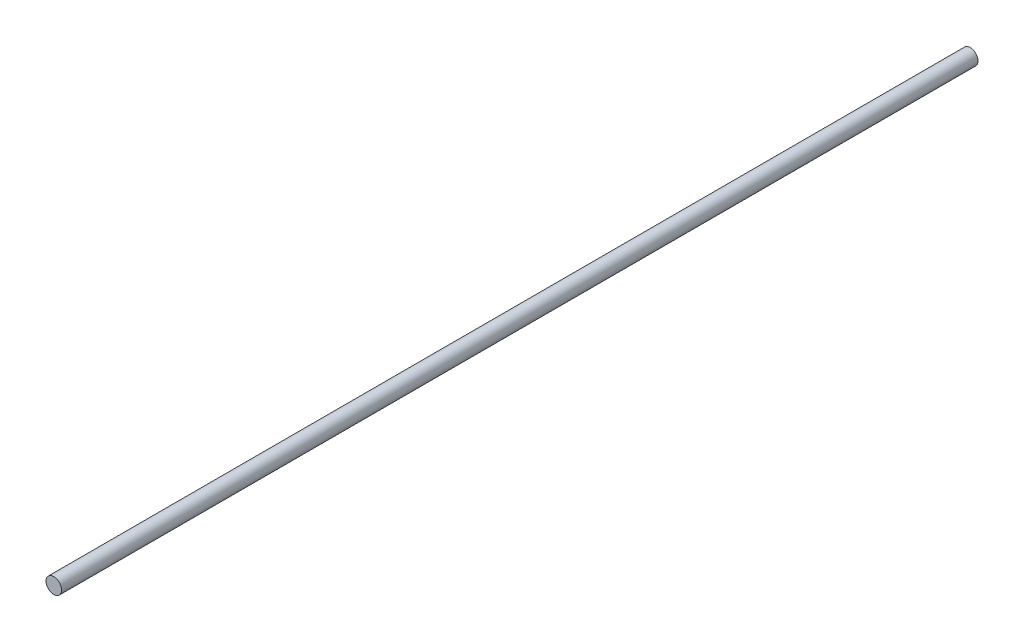
ISO-10303-21;
HEADER;
FILE_DESCRIPTION(('STEP AP214'),'2;1');
FILE_NAME('part.step','',(''),(''),'','','');
FILE_SCHEMA(('AUTOMOTIVE_DESIGN { 1 0 10303 214 1 1 1 1 }'));
ENDSEC;
DATA;
#1=APPLICATION_CONTEXT('core data for automotive mechanical design processes');
#2=APPLICATION_PROTOCOL_DEFINITION('international standard','automotive_design',2000,#1);
#3=PRODUCT_CONTEXT('',#1,'mechanical');
#4=PRODUCT('Part','Part','',(#3));
#5=PRODUCT_RELATED_PRODUCT_CATEGORY('part','',(#4));
#6=PRODUCT_DEFINITION_FORMATION('','',#4);
#7=PRODUCT_DEFINITION_CONTEXT('part definition',#1,'design');
#8=PRODUCT_DEFINITION('design','',#6,#7);
#9=PRODUCT_DEFINITION_SHAPE('','',#8);
#10=(LENGTH_UNIT() NAMED_UNIT(*) SI_UNIT(.MILLI.,.METRE.));
#11=(NAMED_UNIT(*) PLANE_ANGLE_UNIT() SI_UNIT($,.RADIAN.));
#12=(NAMED_UNIT(*) SI_UNIT($,.STERADIAN.) SOLID_ANGLE_UNIT());
#13=UNCERTAINTY_MEASURE_WITH_UNIT(LENGTH_MEASURE(1.E-05),#10,'distance_accuracy_value','');
#14=(GEOMETRIC_REPRESENTATION_CONTEXT(3) GLOBAL_UNCERTAINTY_ASSIGNED_CONTEXT((#13)) GLOBAL_UNIT_ASSIGNED_CONTEXT((#10,
#11,#12)) REPRESENTATION_CONTEXT('',''));
#15=CARTESIAN_POINT('',(0.,0.,0.));
#16=DIRECTION('',(0.,0.,1.));
#17=DIRECTION('',(1.,0.,0.));
#18=AXIS2_PLACEMENT_3D('',#15,#16,#17);
#19=CARTESIAN_POINT('',(0.,0.,140.000000000028));
#20=DIRECTION('',(0.,0.,1.));
#21=DIRECTION('',(1.,0.,0.));
#22=AXIS2_PLACEMENT_3D('',#19,#20,#21);
#23=PLANE('',#22);
#24=CARTESIAN_POINT('',(0.,0.,140.000000000028));
#25=DIRECTION('',(0.,0.,1.));
#26=DIRECTION('',(1.,0.,0.));
#27=AXIS2_PLACEMENT_3D('',#24,#25,#26);
#28=CIRCLE('',#27,1.25);
#29=CARTESIAN_POINT('',(1.25,0.,140.000000000028));
#30=VERTEX_POINT('',#29);
#31=EDGE_CURVE('E40',#30,#30,#28,.T.);
#32=ORIENTED_EDGE('',*,*,#31,.F.);
#33=EDGE_LOOP('',(#32));
#34=FACE_BOUND('',#33,.T.);
#35=ADVANCED_FACE('F33',(#34),#23,.F.);
#36=CARTESIAN_POINT('',(0.,0.,290.53553390596));
#37=DIRECTION('',(0.,0.,-1.));
#38=DIRECTION('',(-1.,0.,0.));
#39=AXIS2_PLACEMENT_3D('',#36,#37,#38);
#40=CYLINDRICAL_SURFACE('',#39,1.25);
#41=CARTESIAN_POINT('',(0.,0.,287.000000000028));
#42=DIRECTION('',(0.,0.,-1.));
#43=DIRECTION('',(-1.,0.,0.));
#44=AXIS2_PLACEMENT_3D('',#41,#42,#43);
#45=CIRCLE('',#44,1.25);
#46=CARTESIAN_POINT('',(-1.25,0.,287.000000000028));
#47=VERTEX_POINT('',#46);
#48=EDGE_CURVE('E10',#47,#47,#45,.T.);
#49=ORIENTED_EDGE('',*,*,#48,.T.);
#50=EDGE_LOOP('',(#49));
#51=FACE_BOUND('',#50,.T.);
#52=ORIENTED_EDGE('',*,*,#31,.T.);
#53=EDGE_LOOP('',(#52));
#54=FACE_BOUND('',#53,.T.);
#55=ADVANCED_FACE('F35',(#51,#54),#40,.T.);
#56=CARTESIAN_POINT('',(61.1182447325147,-69.2890288688371,287.000000000028));
#57=DIRECTION('',(0.,0.,-1.));
#58=DIRECTION('',(-0.645116423972928,0.764084288230285,0.));
#59=AXIS2_PLACEMENT_3D('',#56,#57,#58);
#60=PLANE('',#59);
#61=ORIENTED_EDGE('',*,*,#48,.F.);
#62=EDGE_LOOP('',(#61));
#63=FACE_BOUND('',#62,.T.);
#64=ADVANCED_FACE('F51',(#63),#60,.F.);
#65=CLOSED_SHELL('',(#35,#55,#64));
#66=MANIFOLD_SOLID_BREP('B2',#65);
#67=ADVANCED_BREP_SHAPE_REPRESENTATION('',(#18,#66),#14);
#68=SHAPE_DEFINITION_REPRESENTATION(#9,#67);
ENDSEC;
END-ISO-10303-21;
